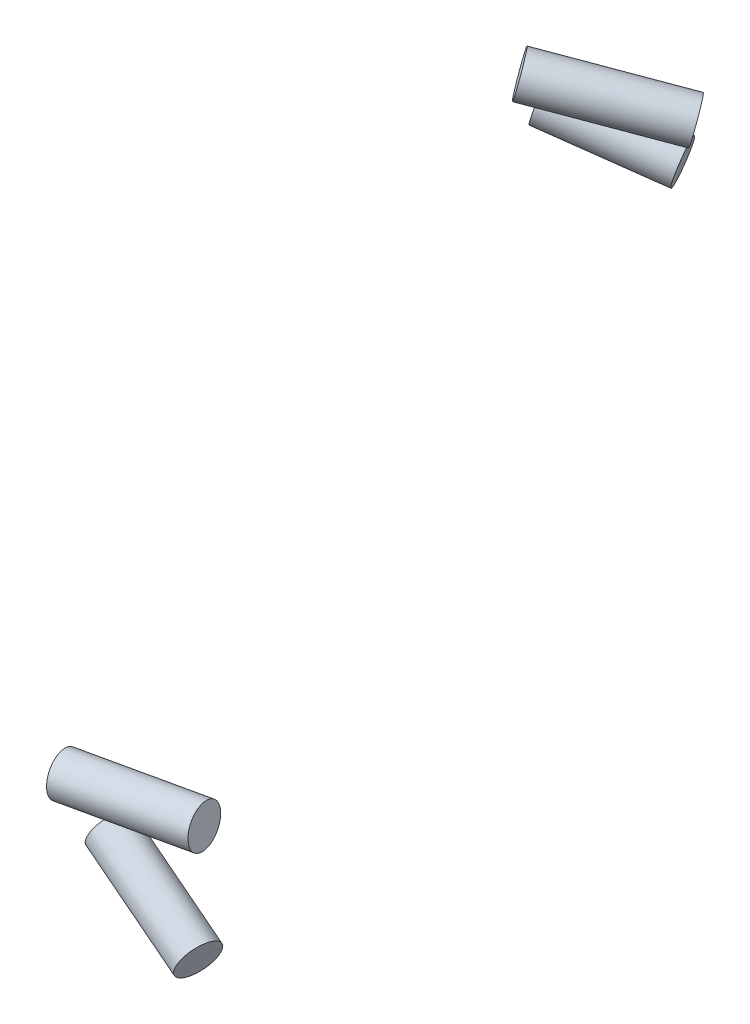
ISO-10303-21;
HEADER;
FILE_DESCRIPTION(('STEP AP214'),'2;1');
FILE_NAME('part.step','',(''),(''),'','','');
FILE_SCHEMA(('AUTOMOTIVE_DESIGN { 1 0 10303 214 1 1 1 1 }'));
ENDSEC;
DATA;
#1=APPLICATION_CONTEXT('core data for automotive mechanical design processes');
#2=APPLICATION_PROTOCOL_DEFINITION('international standard','automotive_design',2000,#1);
#3=PRODUCT_CONTEXT('',#1,'mechanical');
#4=PRODUCT('Part','Part','',(#3));
#5=PRODUCT_RELATED_PRODUCT_CATEGORY('part','',(#4));
#6=PRODUCT_DEFINITION_FORMATION('','',#4);
#7=PRODUCT_DEFINITION_CONTEXT('part definition',#1,'design');
#8=PRODUCT_DEFINITION('design','',#6,#7);
#9=PRODUCT_DEFINITION_SHAPE('','',#8);
#10=(LENGTH_UNIT() NAMED_UNIT(*) SI_UNIT(.MILLI.,.METRE.));
#11=(NAMED_UNIT(*) PLANE_ANGLE_UNIT() SI_UNIT($,.RADIAN.));
#12=(NAMED_UNIT(*) SI_UNIT($,.STERADIAN.) SOLID_ANGLE_UNIT());
#13=UNCERTAINTY_MEASURE_WITH_UNIT(LENGTH_MEASURE(1.E-05),#10,'distance_accuracy_value','');
#14=(GEOMETRIC_REPRESENTATION_CONTEXT(3) GLOBAL_UNCERTAINTY_ASSIGNED_CONTEXT((#13)) GLOBAL_UNIT_ASSIGNED_CONTEXT((#10,
#11,#12)) REPRESENTATION_CONTEXT('',''));
#15=CARTESIAN_POINT('',(0.,0.,0.));
#16=DIRECTION('',(0.,0.,1.));
#17=DIRECTION('',(1.,0.,0.));
#18=AXIS2_PLACEMENT_3D('',#15,#16,#17);
#19=CARTESIAN_POINT('',(-238.279774,1261.68448,-258.540964));
#20=DIRECTION('',(-0.763334513607169,0.231473561017193,0.603108954407184));
#21=DIRECTION('',(0.619945945495735,0.,0.784644521209063));
#22=AXIS2_PLACEMENT_3D('',#19,#20,#21);
#23=PLANE('',#22);
#24=CARTESIAN_POINT('',(-238.279774,1261.68448,-258.540964));
#25=DIRECTION('',(-0.763334513607169,0.231473561017193,0.603108954407184));
#26=DIRECTION('',(0.619945945495735,0.,0.784644521209063));
#27=AXIS2_PLACEMENT_3D('',#24,#25,#26);
#28=CIRCLE('',#27,6.99999999999999);
#29=CARTESIAN_POINT('',(-233.94015238153,1261.68448,-253.048452351537));
#30=VERTEX_POINT('',#29);
#31=EDGE_CURVE('E80',#30,#30,#28,.T.);
#32=ORIENTED_EDGE('',*,*,#31,.F.);
#33=EDGE_LOOP('',(#32));
#34=FACE_BOUND('',#33,.T.);
#35=ADVANCED_FACE('F74',(#34),#23,.F.);
#36=CARTESIAN_POINT('',(-272.150503,1271.95544,-231.779774));
#37=DIRECTION('',(-0.763334513607169,0.231473561017193,0.603108954407184));
#38=DIRECTION('',(0.619945945495735,0.,0.784644521209063));
#39=AXIS2_PLACEMENT_3D('',#36,#37,#38);
#40=PLANE('',#39);
#41=CARTESIAN_POINT('',(-272.150503,1271.95544,-231.779774));
#42=DIRECTION('',(-0.763334513607169,0.231473561017193,0.603108954407184));
#43=DIRECTION('',(0.619945945495735,0.,0.784644521209063));
#44=AXIS2_PLACEMENT_3D('',#41,#42,#43);
#45=CIRCLE('',#44,6.99999999999999);
#46=CARTESIAN_POINT('',(-267.81088138153,1271.95544,-226.287262351536));
#47=VERTEX_POINT('',#46);
#48=EDGE_CURVE('E12',#47,#47,#45,.T.);
#49=ORIENTED_EDGE('',*,*,#48,.T.);
#50=EDGE_LOOP('',(#49));
#51=FACE_BOUND('',#50,.T.);
#52=ADVANCED_FACE('F89',(#51),#40,.T.);
#53=CARTESIAN_POINT('',(-238.279774,1261.68448,-258.540964));
#54=DIRECTION('',(-0.763334513607168,0.231473561017203,0.603108954407181));
#55=DIRECTION('',(0.619945945495734,0.,0.784644521209064));
#56=AXIS2_PLACEMENT_3D('',#53,#54,#55);
#57=CYLINDRICAL_SURFACE('',#56,6.99999999999999);
#58=ORIENTED_EDGE('',*,*,#48,.F.);
#59=EDGE_LOOP('',(#58));
#60=FACE_BOUND('',#59,.T.);
#61=ORIENTED_EDGE('',*,*,#31,.T.);
#62=EDGE_LOOP('',(#61));
#63=FACE_BOUND('',#62,.T.);
#64=ADVANCED_FACE('F86',(#60,#63),#57,.T.);
#65=CLOSED_SHELL('',(#35,#52,#64));
#66=MANIFOLD_SOLID_BREP('B2',#65);
#67=CARTESIAN_POINT('',(-243.984676,1245.82104,-259.67307));
#68=DIRECTION('',(-0.860563559718491,0.279073146393456,0.426085130750529));
#69=DIRECTION('',(0.443713954055414,0.,0.896168470197713));
#70=AXIS2_PLACEMENT_3D('',#67,#68,#69);
#71=PLANE('',#70);
#72=CARTESIAN_POINT('',(-243.984676,1245.82104,-259.67307));
#73=DIRECTION('',(-0.860563559718491,0.279073146393456,0.426085130750529));
#74=DIRECTION('',(0.443713954055414,0.,0.896168470197713));
#75=AXIS2_PLACEMENT_3D('',#72,#73,#74);
#76=CIRCLE('',#75,6.99999999999999);
#77=CARTESIAN_POINT('',(-240.878678321612,1245.82104,-253.399890708616));
#78=VERTEX_POINT('',#77);
#79=EDGE_CURVE('E141',#78,#78,#76,.T.);
#80=ORIENTED_EDGE('',*,*,#79,.F.);
#81=EDGE_LOOP('',(#80));
#82=FACE_BOUND('',#81,.T.);
#83=ADVANCED_FACE('F135',(#82),#71,.F.);
#84=CARTESIAN_POINT('',(-276.582297,1256.39216,-243.533226));
#85=DIRECTION('',(-0.860563559718491,0.279073146393456,0.426085130750529));
#86=DIRECTION('',(0.443713954055414,0.,0.896168470197713));
#87=AXIS2_PLACEMENT_3D('',#84,#85,#86);
#88=PLANE('',#87);
#89=CARTESIAN_POINT('',(-276.582297,1256.39216,-243.533226));
#90=DIRECTION('',(-0.860563559718491,0.279073146393456,0.426085130750529));
#91=DIRECTION('',(0.443713954055414,0.,0.896168470197713));
#92=AXIS2_PLACEMENT_3D('',#89,#90,#91);
#93=CIRCLE('',#92,6.99999999999999);
#94=CARTESIAN_POINT('',(-273.476299321612,1256.39216,-237.260046708616));
#95=VERTEX_POINT('',#94);
#96=EDGE_CURVE('E73',#95,#95,#93,.T.);
#97=ORIENTED_EDGE('',*,*,#96,.T.);
#98=EDGE_LOOP('',(#97));
#99=FACE_BOUND('',#98,.T.);
#100=ADVANCED_FACE('F150',(#99),#88,.T.);
#101=CARTESIAN_POINT('',(-243.984676,1245.82104,-259.67307));
#102=DIRECTION('',(-0.860563559718492,0.279073146393456,0.426085130750528));
#103=DIRECTION('',(0.443713954055413,0.,0.896168470197714));
#104=AXIS2_PLACEMENT_3D('',#101,#102,#103);
#105=CYLINDRICAL_SURFACE('',#104,6.99999999999999);
#106=ORIENTED_EDGE('',*,*,#96,.F.);
#107=EDGE_LOOP('',(#106));
#108=FACE_BOUND('',#107,.T.);
#109=ORIENTED_EDGE('',*,*,#79,.T.);
#110=EDGE_LOOP('',(#109));
#111=FACE_BOUND('',#110,.T.);
#112=ADVANCED_FACE('F147',(#108,#111),#105,.T.);
#113=CLOSED_SHELL('',(#83,#100,#112));
#114=MANIFOLD_SOLID_BREP('B7',#113);
#115=CARTESIAN_POINT('',(-217.967798,1156.31916,-69.0971305999999));
#116=DIRECTION('',(-0.98323094573364,-0.0289381267705845,0.180054136777642));
#117=DIRECTION('',(0.180129574194047,0.,0.983642890738642));
#118=AXIS2_PLACEMENT_3D('',#115,#116,#117);
#119=PLANE('',#118);
#120=CARTESIAN_POINT('',(-217.967798,1156.31916,-69.0971305999999));
#121=DIRECTION('',(-0.98323094573364,-0.0289381267705845,0.180054136777642));
#122=DIRECTION('',(0.180129574194047,0.,0.983642890738642));
#123=AXIS2_PLACEMENT_3D('',#120,#121,#122);
#124=CIRCLE('',#123,7.);
#125=CARTESIAN_POINT('',(-216.706890980642,1156.31916,-62.2116303648295));
#126=VERTEX_POINT('',#125);
#127=EDGE_CURVE('E201',#126,#126,#124,.T.);
#128=ORIENTED_EDGE('',*,*,#127,.F.);
#129=EDGE_LOOP('',(#128));
#130=FACE_BOUND('',#129,.T.);
#131=ADVANCED_FACE('F195',(#130),#119,.F.);
#132=CARTESIAN_POINT('',(-259.065027,1155.1096,-61.5712017999999));
#133=DIRECTION('',(-0.98323094573364,-0.0289381267705845,0.180054136777642));
#134=DIRECTION('',(0.180129574194047,0.,0.983642890738642));
#135=AXIS2_PLACEMENT_3D('',#132,#133,#134);
#136=PLANE('',#135);
#137=CARTESIAN_POINT('',(-259.065027,1155.1096,-61.5712017999999));
#138=DIRECTION('',(-0.98323094573364,-0.0289381267705845,0.180054136777642));
#139=DIRECTION('',(0.180129574194047,0.,0.983642890738642));
#140=AXIS2_PLACEMENT_3D('',#137,#138,#139);
#141=CIRCLE('',#140,7.);
#142=CARTESIAN_POINT('',(-257.804119980642,1155.1096,-54.6857015648294));
#143=VERTEX_POINT('',#142);
#144=EDGE_CURVE('E134',#143,#143,#141,.T.);
#145=ORIENTED_EDGE('',*,*,#144,.T.);
#146=EDGE_LOOP('',(#145));
#147=FACE_BOUND('',#146,.T.);
#148=ADVANCED_FACE('F210',(#147),#136,.T.);
#149=CARTESIAN_POINT('',(-217.967798,1156.31916,-69.0971305999999));
#150=DIRECTION('',(-0.98323094573364,-0.0289381267705792,0.180054136777641));
#151=DIRECTION('',(0.180129574194046,0.,0.983642890738642));
#152=AXIS2_PLACEMENT_3D('',#149,#150,#151);
#153=CYLINDRICAL_SURFACE('',#152,7.);
#154=ORIENTED_EDGE('',*,*,#144,.F.);
#155=EDGE_LOOP('',(#154));
#156=FACE_BOUND('',#155,.T.);
#157=ORIENTED_EDGE('',*,*,#127,.T.);
#158=EDGE_LOOP('',(#157));
#159=FACE_BOUND('',#158,.T.);
#160=ADVANCED_FACE('F207',(#156,#159),#153,.T.);
#161=CLOSED_SHELL('',(#131,#148,#160));
#162=MANIFOLD_SOLID_BREP('B68',#161);
#163=CARTESIAN_POINT('',(-231.564969,1104.02989,-80.5982665));
#164=DIRECTION('',(-0.898746633417957,0.406318121940106,-0.164803133170928));
#165=DIRECTION('',(-0.411950940921273,-0.91120602624987,0.));
#166=AXIS2_PLACEMENT_3D('',#163,#164,#165);
#167=PLANE('',#166);
#168=CARTESIAN_POINT('',(-231.564969,1104.02989,-80.5982665));
#169=DIRECTION('',(-0.898746633417957,0.406318121940106,-0.164803133170928));
#170=DIRECTION('',(-0.411950940921273,-0.91120602624987,0.));
#171=AXIS2_PLACEMENT_3D('',#168,#169,#170);
#172=CIRCLE('',#171,7.00000000000001);
#173=CARTESIAN_POINT('',(-234.448625586449,1097.65144781625,-80.5982665));
#174=VERTEX_POINT('',#173);
#175=EDGE_CURVE('E254',#174,#174,#172,.T.);
#176=ORIENTED_EDGE('',*,*,#175,.F.);
#177=EDGE_LOOP('',(#176));
#178=FACE_BOUND('',#177,.T.);
#179=ADVANCED_FACE('F248',(#178),#167,.F.);
#180=CARTESIAN_POINT('',(-268.814973,1120.8704,-87.4287982));
#181=DIRECTION('',(-0.898746633417957,0.406318121940106,-0.164803133170928));
#182=DIRECTION('',(-0.411950940921273,-0.91120602624987,0.));
#183=AXIS2_PLACEMENT_3D('',#180,#181,#182);
#184=PLANE('',#183);
#185=CARTESIAN_POINT('',(-268.814973,1120.8704,-87.4287982));
#186=DIRECTION('',(-0.898746633417957,0.406318121940106,-0.164803133170928));
#187=DIRECTION('',(-0.411950940921273,-0.91120602624987,0.));
#188=AXIS2_PLACEMENT_3D('',#185,#186,#187);
#189=CIRCLE('',#188,7.00000000000001);
#190=CARTESIAN_POINT('',(-271.698629586449,1114.49195781625,-87.4287982));
#191=VERTEX_POINT('',#190);
#192=EDGE_CURVE('E194',#191,#191,#189,.T.);
#193=ORIENTED_EDGE('',*,*,#192,.T.);
#194=EDGE_LOOP('',(#193));
#195=FACE_BOUND('',#194,.T.);
#196=ADVANCED_FACE('F263',(#195),#184,.T.);
#197=CARTESIAN_POINT('',(-231.564969,1104.02989,-80.5982665));
#198=DIRECTION('',(-0.898746633417957,0.406318121940105,-0.164803133170929));
#199=DIRECTION('',(-0.411950940921273,-0.91120602624987,0.));
#200=AXIS2_PLACEMENT_3D('',#197,#198,#199);
#201=CYLINDRICAL_SURFACE('',#200,7.00000000000001);
#202=ORIENTED_EDGE('',*,*,#192,.F.);
#203=EDGE_LOOP('',(#202));
#204=FACE_BOUND('',#203,.T.);
#205=ORIENTED_EDGE('',*,*,#175,.T.);
#206=EDGE_LOOP('',(#205));
#207=FACE_BOUND('',#206,.T.);
#208=ADVANCED_FACE('F260',(#204,#207),#201,.T.);
#209=CLOSED_SHELL('',(#179,#196,#208));
#210=MANIFOLD_SOLID_BREP('B129',#209);
#211=ADVANCED_BREP_SHAPE_REPRESENTATION('',(#18,#66,#114,#162,#210),#14);
#212=SHAPE_DEFINITION_REPRESENTATION(#9,#211);
ENDSEC;
END-ISO-10303-21;
